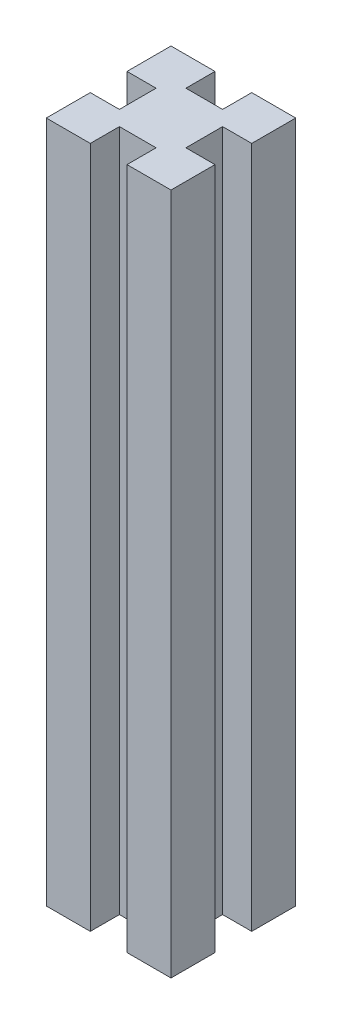
ISO-10303-21;
HEADER;
FILE_DESCRIPTION(('STEP AP214'),'2;1');
FILE_NAME('part.step','',(''),(''),'','','');
FILE_SCHEMA(('AUTOMOTIVE_DESIGN { 1 0 10303 214 1 1 1 1 }'));
ENDSEC;
DATA;
#1=APPLICATION_CONTEXT('core data for automotive mechanical design processes');
#2=APPLICATION_PROTOCOL_DEFINITION('international standard','automotive_design',2000,#1);
#3=PRODUCT_CONTEXT('',#1,'mechanical');
#4=PRODUCT('Part','Part','',(#3));
#5=PRODUCT_RELATED_PRODUCT_CATEGORY('part','',(#4));
#6=PRODUCT_DEFINITION_FORMATION('','',#4);
#7=PRODUCT_DEFINITION_CONTEXT('part definition',#1,'design');
#8=PRODUCT_DEFINITION('design','',#6,#7);
#9=PRODUCT_DEFINITION_SHAPE('','',#8);
#10=(LENGTH_UNIT() NAMED_UNIT(*) SI_UNIT(.MILLI.,.METRE.));
#11=(NAMED_UNIT(*) PLANE_ANGLE_UNIT() SI_UNIT($,.RADIAN.));
#12=(NAMED_UNIT(*) SI_UNIT($,.STERADIAN.) SOLID_ANGLE_UNIT());
#13=UNCERTAINTY_MEASURE_WITH_UNIT(LENGTH_MEASURE(1.E-05),#10,'distance_accuracy_value','');
#14=(GEOMETRIC_REPRESENTATION_CONTEXT(3) GLOBAL_UNCERTAINTY_ASSIGNED_CONTEXT((#13)) GLOBAL_UNIT_ASSIGNED_CONTEXT((#10,
#11,#12)) REPRESENTATION_CONTEXT('',''));
#15=CARTESIAN_POINT('',(0.,0.,0.));
#16=DIRECTION('',(0.,0.,1.));
#17=DIRECTION('',(1.,0.,0.));
#18=AXIS2_PLACEMENT_3D('',#15,#16,#17);
#19=CARTESIAN_POINT('',(4.1,152.4,13.925));
#20=DIRECTION('',(0.,0.,-1.));
#21=DIRECTION('',(-1.,0.,0.));
#22=AXIS2_PLACEMENT_3D('',#19,#20,#21);
#23=PLANE('',#22);
#24=DIRECTION('',(1.,0.,0.));
#25=VECTOR('',#24,1.);
#26=CARTESIAN_POINT('',(4.1,0.,13.925));
#27=LINE('',#26,#25);
#28=CARTESIAN_POINT('',(4.1,0.,13.925));
#29=VERTEX_POINT('',#28);
#30=CARTESIAN_POINT('',(13.925,0.,13.925));
#31=VERTEX_POINT('',#30);
#32=EDGE_CURVE('E218',#29,#31,#27,.T.);
#33=ORIENTED_EDGE('',*,*,#32,.T.);
#34=DIRECTION('',(0.,-1.,0.));
#35=VECTOR('',#34,1.);
#36=CARTESIAN_POINT('',(13.925,152.4,13.925));
#37=LINE('',#36,#35);
#38=CARTESIAN_POINT('',(13.925,152.4,13.925));
#39=VERTEX_POINT('',#38);
#40=EDGE_CURVE('E11',#39,#31,#37,.T.);
#41=ORIENTED_EDGE('',*,*,#40,.F.);
#42=DIRECTION('',(1.,0.,0.));
#43=VECTOR('',#42,1.);
#44=CARTESIAN_POINT('',(4.1,152.4,13.925));
#45=LINE('',#44,#43);
#46=CARTESIAN_POINT('',(4.1,152.4,13.925));
#47=VERTEX_POINT('',#46);
#48=EDGE_CURVE('E276',#47,#39,#45,.T.);
#49=ORIENTED_EDGE('',*,*,#48,.F.);
#50=DIRECTION('',(0.,-1.,0.));
#51=VECTOR('',#50,1.);
#52=CARTESIAN_POINT('',(4.1,152.4,13.925));
#53=LINE('',#52,#51);
#54=EDGE_CURVE('E214',#47,#29,#53,.T.);
#55=ORIENTED_EDGE('',*,*,#54,.T.);
#56=EDGE_LOOP('',(#33,#41,#49,#55));
#57=FACE_BOUND('',#56,.T.);
#58=ADVANCED_FACE('F45',(#57),#23,.F.);
#59=CARTESIAN_POINT('',(13.925,152.4,4.1));
#60=DIRECTION('',(-1.,0.,0.));
#61=DIRECTION('',(0.,0.,1.));
#62=AXIS2_PLACEMENT_3D('',#59,#60,#61);
#63=PLANE('',#62);
#64=DIRECTION('',(0.,0.,-1.));
#65=VECTOR('',#64,1.);
#66=CARTESIAN_POINT('',(13.925,0.,4.1));
#67=LINE('',#66,#65);
#68=CARTESIAN_POINT('',(13.925,0.,4.1));
#69=VERTEX_POINT('',#68);
#70=EDGE_CURVE('E222',#31,#69,#67,.T.);
#71=ORIENTED_EDGE('',*,*,#70,.T.);
#72=DIRECTION('',(0.,-1.,0.));
#73=VECTOR('',#72,1.);
#74=CARTESIAN_POINT('',(13.925,152.4,4.1));
#75=LINE('',#74,#73);
#76=CARTESIAN_POINT('',(13.925,152.4,4.1));
#77=VERTEX_POINT('',#76);
#78=EDGE_CURVE('E54',#77,#69,#75,.T.);
#79=ORIENTED_EDGE('',*,*,#78,.F.);
#80=DIRECTION('',(0.,0.,-1.));
#81=VECTOR('',#80,1.);
#82=CARTESIAN_POINT('',(13.925,152.4,4.1));
#83=LINE('',#82,#81);
#84=EDGE_CURVE('E141',#39,#77,#83,.T.);
#85=ORIENTED_EDGE('',*,*,#84,.F.);
#86=ORIENTED_EDGE('',*,*,#40,.T.);
#87=EDGE_LOOP('',(#71,#79,#85,#86));
#88=FACE_BOUND('',#87,.T.);
#89=ADVANCED_FACE('F426',(#88),#63,.F.);
#90=CARTESIAN_POINT('',(7.425,152.4,4.1));
#91=DIRECTION('',(0.,0.,1.));
#92=DIRECTION('',(1.,0.,0.));
#93=AXIS2_PLACEMENT_3D('',#90,#91,#92);
#94=PLANE('',#93);
#95=DIRECTION('',(-1.,0.,0.));
#96=VECTOR('',#95,1.);
#97=CARTESIAN_POINT('',(7.425,0.,4.1));
#98=LINE('',#97,#96);
#99=CARTESIAN_POINT('',(7.425,0.,4.1));
#100=VERTEX_POINT('',#99);
#101=EDGE_CURVE('E225',#69,#100,#98,.T.);
#102=ORIENTED_EDGE('',*,*,#101,.T.);
#103=DIRECTION('',(0.,-1.,0.));
#104=VECTOR('',#103,1.);
#105=CARTESIAN_POINT('',(7.425,152.4,4.1));
#106=LINE('',#105,#104);
#107=CARTESIAN_POINT('',(7.425,152.4,4.1));
#108=VERTEX_POINT('',#107);
#109=EDGE_CURVE('E335',#108,#100,#106,.T.);
#110=ORIENTED_EDGE('',*,*,#109,.F.);
#111=DIRECTION('',(-1.,0.,0.));
#112=VECTOR('',#111,1.);
#113=CARTESIAN_POINT('',(7.425,152.4,4.1));
#114=LINE('',#113,#112);
#115=EDGE_CURVE('E345',#77,#108,#114,.T.);
#116=ORIENTED_EDGE('',*,*,#115,.F.);
#117=ORIENTED_EDGE('',*,*,#78,.T.);
#118=EDGE_LOOP('',(#102,#110,#116,#117));
#119=FACE_BOUND('',#118,.T.);
#120=ADVANCED_FACE('F343',(#119),#94,.F.);
#121=CARTESIAN_POINT('',(7.425,152.4,-4.1));
#122=DIRECTION('',(-1.,0.,0.));
#123=DIRECTION('',(0.,0.,1.));
#124=AXIS2_PLACEMENT_3D('',#121,#122,#123);
#125=PLANE('',#124);
#126=DIRECTION('',(0.,0.,-1.));
#127=VECTOR('',#126,1.);
#128=CARTESIAN_POINT('',(7.425,0.,-4.1));
#129=LINE('',#128,#127);
#130=CARTESIAN_POINT('',(7.425,0.,-4.1));
#131=VERTEX_POINT('',#130);
#132=EDGE_CURVE('E228',#100,#131,#129,.T.);
#133=ORIENTED_EDGE('',*,*,#132,.T.);
#134=DIRECTION('',(0.,-1.,0.));
#135=VECTOR('',#134,1.);
#136=CARTESIAN_POINT('',(7.425,152.4,-4.1));
#137=LINE('',#136,#135);
#138=CARTESIAN_POINT('',(7.425,152.4,-4.1));
#139=VERTEX_POINT('',#138);
#140=EDGE_CURVE('E331',#139,#131,#137,.T.);
#141=ORIENTED_EDGE('',*,*,#140,.F.);
#142=DIRECTION('',(0.,0.,-1.));
#143=VECTOR('',#142,1.);
#144=CARTESIAN_POINT('',(7.425,152.4,-4.1));
#145=LINE('',#144,#143);
#146=EDGE_CURVE('E364',#108,#139,#145,.T.);
#147=ORIENTED_EDGE('',*,*,#146,.F.);
#148=ORIENTED_EDGE('',*,*,#109,.T.);
#149=EDGE_LOOP('',(#133,#141,#147,#148));
#150=FACE_BOUND('',#149,.T.);
#151=ADVANCED_FACE('F354',(#150),#125,.F.);
#152=CARTESIAN_POINT('',(7.425,152.4,-4.1));
#153=DIRECTION('',(0.,0.,-1.));
#154=DIRECTION('',(-1.,0.,0.));
#155=AXIS2_PLACEMENT_3D('',#152,#153,#154);
#156=PLANE('',#155);
#157=DIRECTION('',(1.,0.,0.));
#158=VECTOR('',#157,1.);
#159=CARTESIAN_POINT('',(7.425,0.,-4.1));
#160=LINE('',#159,#158);
#161=CARTESIAN_POINT('',(13.925,0.,-4.1));
#162=VERTEX_POINT('',#161);
#163=EDGE_CURVE('E231',#131,#162,#160,.T.);
#164=ORIENTED_EDGE('',*,*,#163,.T.);
#165=DIRECTION('',(0.,-1.,0.));
#166=VECTOR('',#165,1.);
#167=CARTESIAN_POINT('',(13.925,152.4,-4.1));
#168=LINE('',#167,#166);
#169=CARTESIAN_POINT('',(13.925,152.4,-4.1));
#170=VERTEX_POINT('',#169);
#171=EDGE_CURVE('E327',#170,#162,#168,.T.);
#172=ORIENTED_EDGE('',*,*,#171,.F.);
#173=DIRECTION('',(1.,0.,0.));
#174=VECTOR('',#173,1.);
#175=CARTESIAN_POINT('',(7.425,152.4,-4.1));
#176=LINE('',#175,#174);
#177=EDGE_CURVE('E360',#139,#170,#176,.T.);
#178=ORIENTED_EDGE('',*,*,#177,.F.);
#179=ORIENTED_EDGE('',*,*,#140,.T.);
#180=EDGE_LOOP('',(#164,#172,#178,#179));
#181=FACE_BOUND('',#180,.T.);
#182=ADVANCED_FACE('F358',(#181),#156,.F.);
#183=CARTESIAN_POINT('',(13.925,152.4,-13.925));
#184=DIRECTION('',(-1.,0.,0.));
#185=DIRECTION('',(0.,0.,1.));
#186=AXIS2_PLACEMENT_3D('',#183,#184,#185);
#187=PLANE('',#186);
#188=DIRECTION('',(0.,0.,-1.));
#189=VECTOR('',#188,1.);
#190=CARTESIAN_POINT('',(13.925,0.,-13.925));
#191=LINE('',#190,#189);
#192=CARTESIAN_POINT('',(13.925,0.,-13.925));
#193=VERTEX_POINT('',#192);
#194=EDGE_CURVE('E234',#162,#193,#191,.T.);
#195=ORIENTED_EDGE('',*,*,#194,.T.);
#196=DIRECTION('',(0.,-1.,0.));
#197=VECTOR('',#196,1.);
#198=CARTESIAN_POINT('',(13.925,152.4,-13.925));
#199=LINE('',#198,#197);
#200=CARTESIAN_POINT('',(13.925,152.4,-13.925));
#201=VERTEX_POINT('',#200);
#202=EDGE_CURVE('E323',#201,#193,#199,.T.);
#203=ORIENTED_EDGE('',*,*,#202,.F.);
#204=DIRECTION('',(0.,0.,-1.));
#205=VECTOR('',#204,1.);
#206=CARTESIAN_POINT('',(13.925,152.4,-13.925));
#207=LINE('',#206,#205);
#208=EDGE_CURVE('E363',#170,#201,#207,.T.);
#209=ORIENTED_EDGE('',*,*,#208,.F.);
#210=ORIENTED_EDGE('',*,*,#171,.T.);
#211=EDGE_LOOP('',(#195,#203,#209,#210));
#212=FACE_BOUND('',#211,.T.);
#213=ADVANCED_FACE('F439',(#212),#187,.F.);
#214=CARTESIAN_POINT('',(4.10000000000001,152.4,-13.925));
#215=DIRECTION('',(0.,0.,1.));
#216=DIRECTION('',(1.,0.,0.));
#217=AXIS2_PLACEMENT_3D('',#214,#215,#216);
#218=PLANE('',#217);
#219=DIRECTION('',(-1.,0.,0.));
#220=VECTOR('',#219,1.);
#221=CARTESIAN_POINT('',(4.10000000000001,0.,-13.925));
#222=LINE('',#221,#220);
#223=CARTESIAN_POINT('',(4.10000000000001,0.,-13.925));
#224=VERTEX_POINT('',#223);
#225=EDGE_CURVE('E237',#193,#224,#222,.T.);
#226=ORIENTED_EDGE('',*,*,#225,.T.);
#227=DIRECTION('',(0.,-1.,0.));
#228=VECTOR('',#227,1.);
#229=CARTESIAN_POINT('',(4.10000000000001,152.4,-13.925));
#230=LINE('',#229,#228);
#231=CARTESIAN_POINT('',(4.10000000000001,152.4,-13.925));
#232=VERTEX_POINT('',#231);
#233=EDGE_CURVE('E319',#232,#224,#230,.T.);
#234=ORIENTED_EDGE('',*,*,#233,.F.);
#235=DIRECTION('',(-1.,0.,0.));
#236=VECTOR('',#235,1.);
#237=CARTESIAN_POINT('',(4.10000000000001,152.4,-13.925));
#238=LINE('',#237,#236);
#239=EDGE_CURVE('E368',#201,#232,#238,.T.);
#240=ORIENTED_EDGE('',*,*,#239,.F.);
#241=ORIENTED_EDGE('',*,*,#202,.T.);
#242=EDGE_LOOP('',(#226,#234,#240,#241));
#243=FACE_BOUND('',#242,.T.);
#244=ADVANCED_FACE('F442',(#243),#218,.F.);
#245=CARTESIAN_POINT('',(4.10000000000001,152.4,-7.425));
#246=DIRECTION('',(1.,0.,0.));
#247=DIRECTION('',(0.,0.,-1.));
#248=AXIS2_PLACEMENT_3D('',#245,#246,#247);
#249=PLANE('',#248);
#250=DIRECTION('',(0.,0.,1.));
#251=VECTOR('',#250,1.);
#252=CARTESIAN_POINT('',(4.10000000000001,0.,-7.425));
#253=LINE('',#252,#251);
#254=CARTESIAN_POINT('',(4.10000000000001,0.,-7.425));
#255=VERTEX_POINT('',#254);
#256=EDGE_CURVE('E240',#224,#255,#253,.T.);
#257=ORIENTED_EDGE('',*,*,#256,.T.);
#258=DIRECTION('',(0.,-1.,0.));
#259=VECTOR('',#258,1.);
#260=CARTESIAN_POINT('',(4.10000000000001,152.4,-7.425));
#261=LINE('',#260,#259);
#262=CARTESIAN_POINT('',(4.10000000000001,152.4,-7.425));
#263=VERTEX_POINT('',#262);
#264=EDGE_CURVE('E315',#263,#255,#261,.T.);
#265=ORIENTED_EDGE('',*,*,#264,.F.);
#266=DIRECTION('',(0.,0.,1.));
#267=VECTOR('',#266,1.);
#268=CARTESIAN_POINT('',(4.10000000000001,152.4,-7.425));
#269=LINE('',#268,#267);
#270=EDGE_CURVE('E375',#232,#263,#269,.T.);
#271=ORIENTED_EDGE('',*,*,#270,.F.);
#272=ORIENTED_EDGE('',*,*,#233,.T.);
#273=EDGE_LOOP('',(#257,#265,#271,#272));
#274=FACE_BOUND('',#273,.T.);
#275=ADVANCED_FACE('F446',(#274),#249,.F.);
#276=CARTESIAN_POINT('',(-4.09999999999999,152.4,-7.425));
#277=DIRECTION('',(0.,0.,1.));
#278=DIRECTION('',(1.,0.,0.));
#279=AXIS2_PLACEMENT_3D('',#276,#277,#278);
#280=PLANE('',#279);
#281=DIRECTION('',(-1.,0.,0.));
#282=VECTOR('',#281,1.);
#283=CARTESIAN_POINT('',(-4.09999999999999,0.,-7.425));
#284=LINE('',#283,#282);
#285=CARTESIAN_POINT('',(-4.09999999999999,0.,-7.425));
#286=VERTEX_POINT('',#285);
#287=EDGE_CURVE('E243',#255,#286,#284,.T.);
#288=ORIENTED_EDGE('',*,*,#287,.T.);
#289=DIRECTION('',(0.,-1.,0.));
#290=VECTOR('',#289,1.);
#291=CARTESIAN_POINT('',(-4.09999999999999,152.4,-7.425));
#292=LINE('',#291,#290);
#293=CARTESIAN_POINT('',(-4.09999999999999,152.4,-7.425));
#294=VERTEX_POINT('',#293);
#295=EDGE_CURVE('E311',#294,#286,#292,.T.);
#296=ORIENTED_EDGE('',*,*,#295,.F.);
#297=DIRECTION('',(-1.,0.,0.));
#298=VECTOR('',#297,1.);
#299=CARTESIAN_POINT('',(-4.09999999999999,152.4,-7.425));
#300=LINE('',#299,#298);
#301=EDGE_CURVE('E378',#263,#294,#300,.T.);
#302=ORIENTED_EDGE('',*,*,#301,.F.);
#303=ORIENTED_EDGE('',*,*,#264,.T.);
#304=EDGE_LOOP('',(#288,#296,#302,#303));
#305=FACE_BOUND('',#304,.T.);
#306=ADVANCED_FACE('F450',(#305),#280,.F.);
#307=CARTESIAN_POINT('',(-4.09999999999999,152.4,-7.425));
#308=DIRECTION('',(-1.,0.,0.));
#309=DIRECTION('',(0.,0.,1.));
#310=AXIS2_PLACEMENT_3D('',#307,#308,#309);
#311=PLANE('',#310);
#312=DIRECTION('',(0.,0.,-1.));
#313=VECTOR('',#312,1.);
#314=CARTESIAN_POINT('',(-4.09999999999999,0.,-7.425));
#315=LINE('',#314,#313);
#316=CARTESIAN_POINT('',(-4.09999999999999,0.,-13.925));
#317=VERTEX_POINT('',#316);
#318=EDGE_CURVE('E246',#286,#317,#315,.T.);
#319=ORIENTED_EDGE('',*,*,#318,.T.);
#320=DIRECTION('',(0.,-1.,0.));
#321=VECTOR('',#320,1.);
#322=CARTESIAN_POINT('',(-4.09999999999999,152.4,-13.925));
#323=LINE('',#322,#321);
#324=CARTESIAN_POINT('',(-4.09999999999999,152.4,-13.925));
#325=VERTEX_POINT('',#324);
#326=EDGE_CURVE('E307',#325,#317,#323,.T.);
#327=ORIENTED_EDGE('',*,*,#326,.F.);
#328=DIRECTION('',(0.,0.,-1.));
#329=VECTOR('',#328,1.);
#330=CARTESIAN_POINT('',(-4.09999999999999,152.4,-7.425));
#331=LINE('',#330,#329);
#332=EDGE_CURVE('E381',#294,#325,#331,.T.);
#333=ORIENTED_EDGE('',*,*,#332,.F.);
#334=ORIENTED_EDGE('',*,*,#295,.T.);
#335=EDGE_LOOP('',(#319,#327,#333,#334));
#336=FACE_BOUND('',#335,.T.);
#337=ADVANCED_FACE('F454',(#336),#311,.F.);
#338=CARTESIAN_POINT('',(-13.925,152.4,-13.925));
#339=DIRECTION('',(0.,0.,1.));
#340=DIRECTION('',(1.,0.,0.));
#341=AXIS2_PLACEMENT_3D('',#338,#339,#340);
#342=PLANE('',#341);
#343=DIRECTION('',(-1.,0.,0.));
#344=VECTOR('',#343,1.);
#345=CARTESIAN_POINT('',(-13.925,0.,-13.925));
#346=LINE('',#345,#344);
#347=CARTESIAN_POINT('',(-13.925,0.,-13.925));
#348=VERTEX_POINT('',#347);
#349=EDGE_CURVE('E249',#317,#348,#346,.T.);
#350=ORIENTED_EDGE('',*,*,#349,.T.);
#351=DIRECTION('',(0.,-1.,0.));
#352=VECTOR('',#351,1.);
#353=CARTESIAN_POINT('',(-13.925,152.4,-13.925));
#354=LINE('',#353,#352);
#355=CARTESIAN_POINT('',(-13.925,152.4,-13.925));
#356=VERTEX_POINT('',#355);
#357=EDGE_CURVE('E303',#356,#348,#354,.T.);
#358=ORIENTED_EDGE('',*,*,#357,.F.);
#359=DIRECTION('',(-1.,0.,0.));
#360=VECTOR('',#359,1.);
#361=CARTESIAN_POINT('',(-13.925,152.4,-13.925));
#362=LINE('',#361,#360);
#363=EDGE_CURVE('E384',#325,#356,#362,.T.);
#364=ORIENTED_EDGE('',*,*,#363,.F.);
#365=ORIENTED_EDGE('',*,*,#326,.T.);
#366=EDGE_LOOP('',(#350,#358,#364,#365));
#367=FACE_BOUND('',#366,.T.);
#368=ADVANCED_FACE('F458',(#367),#342,.F.);
#369=CARTESIAN_POINT('',(-13.925,152.4,-13.925));
#370=DIRECTION('',(1.,0.,0.));
#371=DIRECTION('',(0.,0.,-1.));
#372=AXIS2_PLACEMENT_3D('',#369,#370,#371);
#373=PLANE('',#372);
#374=DIRECTION('',(0.,0.,1.));
#375=VECTOR('',#374,1.);
#376=CARTESIAN_POINT('',(-13.925,0.,-13.925));
#377=LINE('',#376,#375);
#378=CARTESIAN_POINT('',(-13.925,0.,-4.1));
#379=VERTEX_POINT('',#378);
#380=EDGE_CURVE('E252',#348,#379,#377,.T.);
#381=ORIENTED_EDGE('',*,*,#380,.T.);
#382=DIRECTION('',(0.,-1.,0.));
#383=VECTOR('',#382,1.);
#384=CARTESIAN_POINT('',(-13.925,152.4,-4.1));
#385=LINE('',#384,#383);
#386=CARTESIAN_POINT('',(-13.925,152.4,-4.1));
#387=VERTEX_POINT('',#386);
#388=EDGE_CURVE('E299',#387,#379,#385,.T.);
#389=ORIENTED_EDGE('',*,*,#388,.F.);
#390=DIRECTION('',(0.,0.,1.));
#391=VECTOR('',#390,1.);
#392=CARTESIAN_POINT('',(-13.925,152.4,-13.925));
#393=LINE('',#392,#391);
#394=EDGE_CURVE('E387',#356,#387,#393,.T.);
#395=ORIENTED_EDGE('',*,*,#394,.F.);
#396=ORIENTED_EDGE('',*,*,#357,.T.);
#397=EDGE_LOOP('',(#381,#389,#395,#396));
#398=FACE_BOUND('',#397,.T.);
#399=ADVANCED_FACE('F462',(#398),#373,.F.);
#400=CARTESIAN_POINT('',(-7.425,152.4,-4.1));
#401=DIRECTION('',(0.,0.,-1.));
#402=DIRECTION('',(-1.,0.,0.));
#403=AXIS2_PLACEMENT_3D('',#400,#401,#402);
#404=PLANE('',#403);
#405=DIRECTION('',(1.,0.,0.));
#406=VECTOR('',#405,1.);
#407=CARTESIAN_POINT('',(-7.425,0.,-4.1));
#408=LINE('',#407,#406);
#409=CARTESIAN_POINT('',(-7.425,0.,-4.1));
#410=VERTEX_POINT('',#409);
#411=EDGE_CURVE('E255',#379,#410,#408,.T.);
#412=ORIENTED_EDGE('',*,*,#411,.T.);
#413=DIRECTION('',(0.,-1.,0.));
#414=VECTOR('',#413,1.);
#415=CARTESIAN_POINT('',(-7.425,152.4,-4.1));
#416=LINE('',#415,#414);
#417=CARTESIAN_POINT('',(-7.425,152.4,-4.1));
#418=VERTEX_POINT('',#417);
#419=EDGE_CURVE('E295',#418,#410,#416,.T.);
#420=ORIENTED_EDGE('',*,*,#419,.F.);
#421=DIRECTION('',(1.,0.,0.));
#422=VECTOR('',#421,1.);
#423=CARTESIAN_POINT('',(-7.425,152.4,-4.1));
#424=LINE('',#423,#422);
#425=EDGE_CURVE('E390',#387,#418,#424,.T.);
#426=ORIENTED_EDGE('',*,*,#425,.F.);
#427=ORIENTED_EDGE('',*,*,#388,.T.);
#428=EDGE_LOOP('',(#412,#420,#426,#427));
#429=FACE_BOUND('',#428,.T.);
#430=ADVANCED_FACE('F466',(#429),#404,.F.);
#431=CARTESIAN_POINT('',(-7.425,152.4,4.1));
#432=DIRECTION('',(1.,0.,0.));
#433=DIRECTION('',(0.,0.,-1.));
#434=AXIS2_PLACEMENT_3D('',#431,#432,#433);
#435=PLANE('',#434);
#436=DIRECTION('',(0.,0.,1.));
#437=VECTOR('',#436,1.);
#438=CARTESIAN_POINT('',(-7.425,0.,4.1));
#439=LINE('',#438,#437);
#440=CARTESIAN_POINT('',(-7.425,0.,4.1));
#441=VERTEX_POINT('',#440);
#442=EDGE_CURVE('E258',#410,#441,#439,.T.);
#443=ORIENTED_EDGE('',*,*,#442,.T.);
#444=DIRECTION('',(0.,-1.,0.));
#445=VECTOR('',#444,1.);
#446=CARTESIAN_POINT('',(-7.425,152.4,4.1));
#447=LINE('',#446,#445);
#448=CARTESIAN_POINT('',(-7.425,152.4,4.1));
#449=VERTEX_POINT('',#448);
#450=EDGE_CURVE('E291',#449,#441,#447,.T.);
#451=ORIENTED_EDGE('',*,*,#450,.F.);
#452=DIRECTION('',(0.,0.,1.));
#453=VECTOR('',#452,1.);
#454=CARTESIAN_POINT('',(-7.425,152.4,4.1));
#455=LINE('',#454,#453);
#456=EDGE_CURVE('E393',#418,#449,#455,.T.);
#457=ORIENTED_EDGE('',*,*,#456,.F.);
#458=ORIENTED_EDGE('',*,*,#419,.T.);
#459=EDGE_LOOP('',(#443,#451,#457,#458));
#460=FACE_BOUND('',#459,.T.);
#461=ADVANCED_FACE('F470',(#460),#435,.F.);
#462=CARTESIAN_POINT('',(-7.425,152.4,4.1));
#463=DIRECTION('',(0.,0.,1.));
#464=DIRECTION('',(1.,0.,0.));
#465=AXIS2_PLACEMENT_3D('',#462,#463,#464);
#466=PLANE('',#465);
#467=DIRECTION('',(-1.,0.,0.));
#468=VECTOR('',#467,1.);
#469=CARTESIAN_POINT('',(-7.425,0.,4.1));
#470=LINE('',#469,#468);
#471=CARTESIAN_POINT('',(-13.925,0.,4.1));
#472=VERTEX_POINT('',#471);
#473=EDGE_CURVE('E261',#441,#472,#470,.T.);
#474=ORIENTED_EDGE('',*,*,#473,.T.);
#475=DIRECTION('',(0.,-1.,0.));
#476=VECTOR('',#475,1.);
#477=CARTESIAN_POINT('',(-13.925,152.4,4.1));
#478=LINE('',#477,#476);
#479=CARTESIAN_POINT('',(-13.925,152.4,4.1));
#480=VERTEX_POINT('',#479);
#481=EDGE_CURVE('E287',#480,#472,#478,.T.);
#482=ORIENTED_EDGE('',*,*,#481,.F.);
#483=DIRECTION('',(-1.,0.,0.));
#484=VECTOR('',#483,1.);
#485=CARTESIAN_POINT('',(-7.425,152.4,4.1));
#486=LINE('',#485,#484);
#487=EDGE_CURVE('E396',#449,#480,#486,.T.);
#488=ORIENTED_EDGE('',*,*,#487,.F.);
#489=ORIENTED_EDGE('',*,*,#450,.T.);
#490=EDGE_LOOP('',(#474,#482,#488,#489));
#491=FACE_BOUND('',#490,.T.);
#492=ADVANCED_FACE('F474',(#491),#466,.F.);
#493=CARTESIAN_POINT('',(-13.925,152.4,4.1));
#494=DIRECTION('',(1.,0.,0.));
#495=DIRECTION('',(0.,0.,-1.));
#496=AXIS2_PLACEMENT_3D('',#493,#494,#495);
#497=PLANE('',#496);
#498=DIRECTION('',(0.,0.,1.));
#499=VECTOR('',#498,1.);
#500=CARTESIAN_POINT('',(-13.925,0.,4.1));
#501=LINE('',#500,#499);
#502=CARTESIAN_POINT('',(-13.925,0.,13.925));
#503=VERTEX_POINT('',#502);
#504=EDGE_CURVE('E264',#472,#503,#501,.T.);
#505=ORIENTED_EDGE('',*,*,#504,.T.);
#506=DIRECTION('',(0.,-1.,0.));
#507=VECTOR('',#506,1.);
#508=CARTESIAN_POINT('',(-13.925,152.4,13.925));
#509=LINE('',#508,#507);
#510=CARTESIAN_POINT('',(-13.925,152.4,13.925));
#511=VERTEX_POINT('',#510);
#512=EDGE_CURVE('E283',#511,#503,#509,.T.);
#513=ORIENTED_EDGE('',*,*,#512,.F.);
#514=DIRECTION('',(0.,0.,1.));
#515=VECTOR('',#514,1.);
#516=CARTESIAN_POINT('',(-13.925,152.4,4.1));
#517=LINE('',#516,#515);
#518=EDGE_CURVE('E399',#480,#511,#517,.T.);
#519=ORIENTED_EDGE('',*,*,#518,.F.);
#520=ORIENTED_EDGE('',*,*,#481,.T.);
#521=EDGE_LOOP('',(#505,#513,#519,#520));
#522=FACE_BOUND('',#521,.T.);
#523=ADVANCED_FACE('F407',(#522),#497,.F.);
#524=CARTESIAN_POINT('',(-13.925,152.4,13.925));
#525=DIRECTION('',(0.,0.,-1.));
#526=DIRECTION('',(-1.,0.,0.));
#527=AXIS2_PLACEMENT_3D('',#524,#525,#526);
#528=PLANE('',#527);
#529=DIRECTION('',(1.,0.,0.));
#530=VECTOR('',#529,1.);
#531=CARTESIAN_POINT('',(-13.925,0.,13.925));
#532=LINE('',#531,#530);
#533=CARTESIAN_POINT('',(-4.1,0.,13.925));
#534=VERTEX_POINT('',#533);
#535=EDGE_CURVE('E267',#503,#534,#532,.T.);
#536=ORIENTED_EDGE('',*,*,#535,.T.);
#537=DIRECTION('',(0.,-1.,0.));
#538=VECTOR('',#537,1.);
#539=CARTESIAN_POINT('',(-4.1,152.4,13.925));
#540=LINE('',#539,#538);
#541=CARTESIAN_POINT('',(-4.1,152.4,13.925));
#542=VERTEX_POINT('',#541);
#543=EDGE_CURVE('E207',#542,#534,#540,.T.);
#544=ORIENTED_EDGE('',*,*,#543,.F.);
#545=DIRECTION('',(1.,0.,0.));
#546=VECTOR('',#545,1.);
#547=CARTESIAN_POINT('',(-13.925,152.4,13.925));
#548=LINE('',#547,#546);
#549=EDGE_CURVE('E196',#511,#542,#548,.T.);
#550=ORIENTED_EDGE('',*,*,#549,.F.);
#551=ORIENTED_EDGE('',*,*,#512,.T.);
#552=EDGE_LOOP('',(#536,#544,#550,#551));
#553=FACE_BOUND('',#552,.T.);
#554=ADVANCED_FACE('F411',(#553),#528,.F.);
#555=CARTESIAN_POINT('',(-4.1,152.4,7.425));
#556=DIRECTION('',(-1.,0.,0.));
#557=DIRECTION('',(0.,0.,1.));
#558=AXIS2_PLACEMENT_3D('',#555,#556,#557);
#559=PLANE('',#558);
#560=DIRECTION('',(0.,0.,-1.));
#561=VECTOR('',#560,1.);
#562=CARTESIAN_POINT('',(-4.1,0.,7.425));
#563=LINE('',#562,#561);
#564=CARTESIAN_POINT('',(-4.1,0.,7.425));
#565=VERTEX_POINT('',#564);
#566=EDGE_CURVE('E205',#534,#565,#563,.T.);
#567=ORIENTED_EDGE('',*,*,#566,.T.);
#568=DIRECTION('',(0.,-1.,0.));
#569=VECTOR('',#568,1.);
#570=CARTESIAN_POINT('',(-4.1,152.4,7.425));
#571=LINE('',#570,#569);
#572=CARTESIAN_POINT('',(-4.1,152.4,7.425));
#573=VERTEX_POINT('',#572);
#574=EDGE_CURVE('E202',#573,#565,#571,.T.);
#575=ORIENTED_EDGE('',*,*,#574,.F.);
#576=DIRECTION('',(0.,0.,-1.));
#577=VECTOR('',#576,1.);
#578=CARTESIAN_POINT('',(-4.1,152.4,7.425));
#579=LINE('',#578,#577);
#580=EDGE_CURVE('E190',#542,#573,#579,.T.);
#581=ORIENTED_EDGE('',*,*,#580,.F.);
#582=ORIENTED_EDGE('',*,*,#543,.T.);
#583=EDGE_LOOP('',(#567,#575,#581,#582));
#584=FACE_BOUND('',#583,.T.);
#585=ADVANCED_FACE('F203',(#584),#559,.F.);
#586=CARTESIAN_POINT('',(4.1,152.4,7.425));
#587=DIRECTION('',(0.,0.,-1.));
#588=DIRECTION('',(-1.,0.,0.));
#589=AXIS2_PLACEMENT_3D('',#586,#587,#588);
#590=PLANE('',#589);
#591=DIRECTION('',(1.,0.,0.));
#592=VECTOR('',#591,1.);
#593=CARTESIAN_POINT('',(4.1,0.,7.425));
#594=LINE('',#593,#592);
#595=CARTESIAN_POINT('',(4.1,0.,7.425));
#596=VERTEX_POINT('',#595);
#597=EDGE_CURVE('E127',#565,#596,#594,.T.);
#598=ORIENTED_EDGE('',*,*,#597,.T.);
#599=DIRECTION('',(0.,-1.,0.));
#600=VECTOR('',#599,1.);
#601=CARTESIAN_POINT('',(4.1,152.4,7.425));
#602=LINE('',#601,#600);
#603=CARTESIAN_POINT('',(4.1,152.4,7.425));
#604=VERTEX_POINT('',#603);
#605=EDGE_CURVE('E208',#604,#596,#602,.T.);
#606=ORIENTED_EDGE('',*,*,#605,.F.);
#607=DIRECTION('',(1.,0.,0.));
#608=VECTOR('',#607,1.);
#609=CARTESIAN_POINT('',(4.1,152.4,7.425));
#610=LINE('',#609,#608);
#611=EDGE_CURVE('E194',#573,#604,#610,.T.);
#612=ORIENTED_EDGE('',*,*,#611,.F.);
#613=ORIENTED_EDGE('',*,*,#574,.T.);
#614=EDGE_LOOP('',(#598,#606,#612,#613));
#615=FACE_BOUND('',#614,.T.);
#616=ADVANCED_FACE('F210',(#615),#590,.F.);
#617=CARTESIAN_POINT('',(4.1,152.4,7.425));
#618=DIRECTION('',(1.,0.,0.));
#619=DIRECTION('',(0.,0.,-1.));
#620=AXIS2_PLACEMENT_3D('',#617,#618,#619);
#621=PLANE('',#620);
#622=DIRECTION('',(0.,0.,1.));
#623=VECTOR('',#622,1.);
#624=CARTESIAN_POINT('',(4.1,0.,7.425));
#625=LINE('',#624,#623);
#626=EDGE_CURVE('E133',#596,#29,#625,.T.);
#627=ORIENTED_EDGE('',*,*,#626,.T.);
#628=ORIENTED_EDGE('',*,*,#54,.F.);
#629=DIRECTION('',(0.,0.,1.));
#630=VECTOR('',#629,1.);
#631=CARTESIAN_POINT('',(4.1,152.4,7.425));
#632=LINE('',#631,#630);
#633=EDGE_CURVE('E62',#604,#47,#632,.T.);
#634=ORIENTED_EDGE('',*,*,#633,.F.);
#635=ORIENTED_EDGE('',*,*,#605,.T.);
#636=EDGE_LOOP('',(#627,#628,#634,#635));
#637=FACE_BOUND('',#636,.T.);
#638=ADVANCED_FACE('F415',(#637),#621,.F.);
#639=CARTESIAN_POINT('',(0.,152.4,0.));
#640=DIRECTION('',(0.,-1.,0.));
#641=DIRECTION('',(0.,0.,-1.));
#642=AXIS2_PLACEMENT_3D('',#639,#640,#641);
#643=PLANE('',#642);
#644=ORIENTED_EDGE('',*,*,#48,.T.);
#645=ORIENTED_EDGE('',*,*,#84,.T.);
#646=ORIENTED_EDGE('',*,*,#115,.T.);
#647=ORIENTED_EDGE('',*,*,#146,.T.);
#648=ORIENTED_EDGE('',*,*,#177,.T.);
#649=ORIENTED_EDGE('',*,*,#208,.T.);
#650=ORIENTED_EDGE('',*,*,#239,.T.);
#651=ORIENTED_EDGE('',*,*,#270,.T.);
#652=ORIENTED_EDGE('',*,*,#301,.T.);
#653=ORIENTED_EDGE('',*,*,#332,.T.);
#654=ORIENTED_EDGE('',*,*,#363,.T.);
#655=ORIENTED_EDGE('',*,*,#394,.T.);
#656=ORIENTED_EDGE('',*,*,#425,.T.);
#657=ORIENTED_EDGE('',*,*,#456,.T.);
#658=ORIENTED_EDGE('',*,*,#487,.T.);
#659=ORIENTED_EDGE('',*,*,#518,.T.);
#660=ORIENTED_EDGE('',*,*,#549,.T.);
#661=ORIENTED_EDGE('',*,*,#580,.T.);
#662=ORIENTED_EDGE('',*,*,#611,.T.);
#663=ORIENTED_EDGE('',*,*,#633,.T.);
#664=EDGE_LOOP('',(#644,#645,#646,#647,#648,#649,#650,#651,#652,#653,#654,#655,#656,#657,#658,
#659,#660,#661,#662,#663));
#665=FACE_BOUND('',#664,.T.);
#666=ADVANCED_FACE('F192',(#665),#643,.F.);
#667=CARTESIAN_POINT('',(0.,0.,0.));
#668=DIRECTION('',(0.,-1.,0.));
#669=DIRECTION('',(0.,0.,-1.));
#670=AXIS2_PLACEMENT_3D('',#667,#668,#669);
#671=PLANE('',#670);
#672=ORIENTED_EDGE('',*,*,#32,.F.);
#673=ORIENTED_EDGE('',*,*,#626,.F.);
#674=ORIENTED_EDGE('',*,*,#597,.F.);
#675=ORIENTED_EDGE('',*,*,#566,.F.);
#676=ORIENTED_EDGE('',*,*,#535,.F.);
#677=ORIENTED_EDGE('',*,*,#504,.F.);
#678=ORIENTED_EDGE('',*,*,#473,.F.);
#679=ORIENTED_EDGE('',*,*,#442,.F.);
#680=ORIENTED_EDGE('',*,*,#411,.F.);
#681=ORIENTED_EDGE('',*,*,#380,.F.);
#682=ORIENTED_EDGE('',*,*,#349,.F.);
#683=ORIENTED_EDGE('',*,*,#318,.F.);
#684=ORIENTED_EDGE('',*,*,#287,.F.);
#685=ORIENTED_EDGE('',*,*,#256,.F.);
#686=ORIENTED_EDGE('',*,*,#225,.F.);
#687=ORIENTED_EDGE('',*,*,#194,.F.);
#688=ORIENTED_EDGE('',*,*,#163,.F.);
#689=ORIENTED_EDGE('',*,*,#132,.F.);
#690=ORIENTED_EDGE('',*,*,#101,.F.);
#691=ORIENTED_EDGE('',*,*,#70,.F.);
#692=EDGE_LOOP('',(#672,#673,#674,#675,#676,#677,#678,#679,#680,#681,#682,#683,#684,#685,#686,
#687,#688,#689,#690,#691));
#693=FACE_BOUND('',#692,.T.);
#694=ADVANCED_FACE('F349',(#693),#671,.T.);
#695=CLOSED_SHELL('',(#58,#89,#120,#151,#182,#213,#244,#275,#306,#337,#368,#399,#430,#461,#492,
#523,#554,#585,#616,#638,#666,#694));
#696=MANIFOLD_SOLID_BREP('B2',#695);
#697=ADVANCED_BREP_SHAPE_REPRESENTATION('',(#18,#696),#14);
#698=SHAPE_DEFINITION_REPRESENTATION(#9,#697);
ENDSEC;
END-ISO-10303-21;
